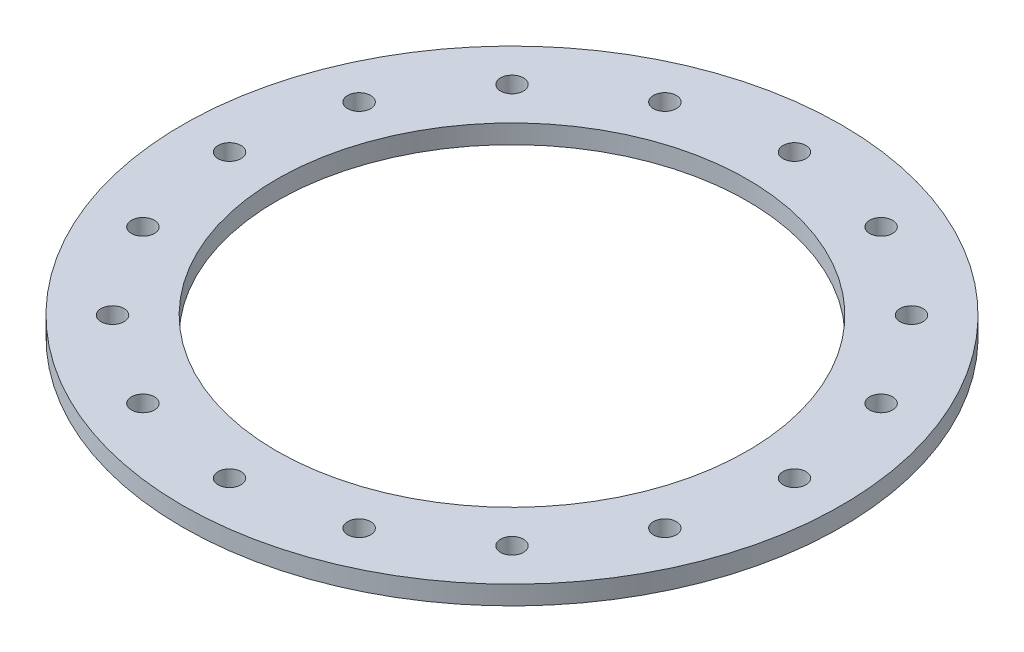
ISO-10303-21;
HEADER;
FILE_DESCRIPTION(('STEP AP214'),'2;1');
FILE_NAME('part.step','',(''),(''),'','','');
FILE_SCHEMA(('AUTOMOTIVE_DESIGN { 1 0 10303 214 1 1 1 1 }'));
ENDSEC;
DATA;
#1=APPLICATION_CONTEXT('core data for automotive mechanical design processes');
#2=APPLICATION_PROTOCOL_DEFINITION('international standard','automotive_design',2000,#1);
#3=PRODUCT_CONTEXT('',#1,'mechanical');
#4=PRODUCT('Part','Part','',(#3));
#5=PRODUCT_RELATED_PRODUCT_CATEGORY('part','',(#4));
#6=PRODUCT_DEFINITION_FORMATION('','',#4);
#7=PRODUCT_DEFINITION_CONTEXT('part definition',#1,'design');
#8=PRODUCT_DEFINITION('design','',#6,#7);
#9=PRODUCT_DEFINITION_SHAPE('','',#8);
#10=(LENGTH_UNIT() NAMED_UNIT(*) SI_UNIT(.MILLI.,.METRE.));
#11=(NAMED_UNIT(*) PLANE_ANGLE_UNIT() SI_UNIT($,.RADIAN.));
#12=(NAMED_UNIT(*) SI_UNIT($,.STERADIAN.) SOLID_ANGLE_UNIT());
#13=UNCERTAINTY_MEASURE_WITH_UNIT(LENGTH_MEASURE(1.E-05),#10,'distance_accuracy_value','');
#14=(GEOMETRIC_REPRESENTATION_CONTEXT(3) GLOBAL_UNCERTAINTY_ASSIGNED_CONTEXT((#13)) GLOBAL_UNIT_ASSIGNED_CONTEXT((#10,
#11,#12)) REPRESENTATION_CONTEXT('',''));
#15=CARTESIAN_POINT('',(0.,0.,0.));
#16=DIRECTION('',(0.,0.,1.));
#17=DIRECTION('',(1.,0.,0.));
#18=AXIS2_PLACEMENT_3D('',#15,#16,#17);
#19=CARTESIAN_POINT('',(0.,5.,0.));
#20=DIRECTION('',(0.,1.,0.));
#21=DIRECTION('',(0.,0.,1.));
#22=AXIS2_PLACEMENT_3D('',#19,#20,#21);
#23=PLANE('',#22);
#24=CARTESIAN_POINT('',(-106.066017177972,5.,-106.066017177958));
#25=DIRECTION('',(0.,1.,0.));
#26=DIRECTION('',(0.,0.,1.));
#27=AXIS2_PLACEMENT_3D('',#24,#25,#26);
#28=CIRCLE('',#27,6.09999999999999);
#29=CARTESIAN_POINT('',(-106.066017177972,5.,-99.9660171779577));
#30=VERTEX_POINT('',#29);
#31=EDGE_CURVE('E131',#30,#30,#28,.T.);
#32=ORIENTED_EDGE('',*,*,#31,.F.);
#33=EDGE_LOOP('',(#32));
#34=FACE_BOUND('',#33,.T.);
#35=CARTESIAN_POINT('',(-149.999999999965,5.,3.45529021714393E-11));
#36=DIRECTION('',(0.,1.,0.));
#37=DIRECTION('',(0.,0.,1.));
#38=AXIS2_PLACEMENT_3D('',#35,#36,#37);
#39=CIRCLE('',#38,6.09999999999998);
#40=CARTESIAN_POINT('',(-149.999999999965,5.,6.10000000003454));
#41=VERTEX_POINT('',#40);
#42=EDGE_CURVE('E119',#41,#41,#39,.T.);
#43=ORIENTED_EDGE('',*,*,#42,.F.);
#44=EDGE_LOOP('',(#43));
#45=FACE_BOUND('',#44,.T.);
#46=CARTESIAN_POINT('',(-106.066017177923,5.,106.066017178007));
#47=DIRECTION('',(0.,1.,0.));
#48=DIRECTION('',(0.,0.,1.));
#49=AXIS2_PLACEMENT_3D('',#46,#47,#48);
#50=CIRCLE('',#49,6.09999999999999);
#51=CARTESIAN_POINT('',(-106.066017177923,5.,112.166017178007));
#52=VERTEX_POINT('',#51);
#53=EDGE_CURVE('E107',#52,#52,#50,.T.);
#54=ORIENTED_EDGE('',*,*,#53,.F.);
#55=EDGE_LOOP('',(#54));
#56=FACE_BOUND('',#55,.T.);
#57=CARTESIAN_POINT('',(6.90690649389042E-11,5.,150.));
#58=DIRECTION('',(0.,1.,0.));
#59=DIRECTION('',(0.,0.,1.));
#60=AXIS2_PLACEMENT_3D('',#57,#58,#59);
#61=CIRCLE('',#60,6.1);
#62=CARTESIAN_POINT('',(6.90690649389042E-11,5.,156.1));
#63=VERTEX_POINT('',#62);
#64=EDGE_CURVE('E95',#63,#63,#61,.T.);
#65=ORIENTED_EDGE('',*,*,#64,.F.);
#66=EDGE_LOOP('',(#65));
#67=FACE_BOUND('',#66,.T.);
#68=CARTESIAN_POINT('',(106.066017178041,5.,106.066017177958));
#69=DIRECTION('',(0.,1.,0.));
#70=DIRECTION('',(0.,0.,1.));
#71=AXIS2_PLACEMENT_3D('',#68,#69,#70);
#72=CIRCLE('',#71,6.09999999999999);
#73=CARTESIAN_POINT('',(106.066017178041,5.,112.166017177958));
#74=VERTEX_POINT('',#73);
#75=EDGE_CURVE('E83',#74,#74,#72,.T.);
#76=ORIENTED_EDGE('',*,*,#75,.F.);
#77=EDGE_LOOP('',(#76));
#78=FACE_BOUND('',#77,.T.);
#79=CARTESIAN_POINT('',(150.000000000035,5.,-3.45345324694521E-11));
#80=DIRECTION('',(0.,1.,0.));
#81=DIRECTION('',(0.,0.,1.));
#82=AXIS2_PLACEMENT_3D('',#79,#80,#81);
#83=CIRCLE('',#82,6.09999999999998);
#84=CARTESIAN_POINT('',(150.000000000035,5.,6.09999999996545));
#85=VERTEX_POINT('',#84);
#86=EDGE_CURVE('E71',#85,#85,#83,.T.);
#87=ORIENTED_EDGE('',*,*,#86,.F.);
#88=EDGE_LOOP('',(#87));
#89=FACE_BOUND('',#88,.T.);
#90=CARTESIAN_POINT('',(106.066017177992,5.,-106.066017178007));
#91=DIRECTION('',(0.,1.,0.));
#92=DIRECTION('',(0.,0.,1.));
#93=AXIS2_PLACEMENT_3D('',#90,#91,#92);
#94=CIRCLE('',#93,6.09999999999999);
#95=CARTESIAN_POINT('',(106.066017177992,5.,-99.9660171780066));
#96=VERTEX_POINT('',#95);
#97=EDGE_CURVE('E59',#96,#96,#94,.T.);
#98=ORIENTED_EDGE('',*,*,#97,.F.);
#99=EDGE_LOOP('',(#98));
#100=FACE_BOUND('',#99,.T.);
#101=CARTESIAN_POINT('',(0.,5.,-150.));
#102=DIRECTION('',(0.,1.,0.));
#103=DIRECTION('',(0.,0.,1.));
#104=AXIS2_PLACEMENT_3D('',#101,#102,#103);
#105=CIRCLE('',#104,6.1);
#106=CARTESIAN_POINT('',(0.,5.,-143.9));
#107=VERTEX_POINT('',#106);
#108=EDGE_CURVE('E47',#107,#107,#105,.T.);
#109=ORIENTED_EDGE('',*,*,#108,.F.);
#110=EDGE_LOOP('',(#109));
#111=FACE_BOUND('',#110,.T.);
#112=CARTESIAN_POINT('',(0.,5.,0.));
#113=DIRECTION('',(0.,1.,0.));
#114=DIRECTION('',(0.,0.,1.));
#115=AXIS2_PLACEMENT_3D('',#112,#113,#114);
#116=CIRCLE('',#115,175.);
#117=CARTESIAN_POINT('',(0.,5.,175.));
#118=VERTEX_POINT('',#117);
#119=EDGE_CURVE('E10',#118,#118,#116,.T.);
#120=ORIENTED_EDGE('',*,*,#119,.T.);
#121=EDGE_LOOP('',(#120));
#122=FACE_BOUND('',#121,.T.);
#123=CARTESIAN_POINT('',(0.,5.,0.));
#124=DIRECTION('',(0.,1.,0.));
#125=DIRECTION('',(0.,0.,1.));
#126=AXIS2_PLACEMENT_3D('',#123,#124,#125);
#127=CIRCLE('',#126,125.);
#128=CARTESIAN_POINT('',(0.,5.,125.));
#129=VERTEX_POINT('',#128);
#130=EDGE_CURVE('E42',#129,#129,#127,.T.);
#131=ORIENTED_EDGE('',*,*,#130,.F.);
#132=EDGE_LOOP('',(#131));
#133=FACE_BOUND('',#132,.T.);
#134=CARTESIAN_POINT('',(57.402514854766,5.,-138.581929876706));
#135=DIRECTION('',(0.,1.,0.));
#136=DIRECTION('',(0.,0.,1.));
#137=AXIS2_PLACEMENT_3D('',#134,#135,#136);
#138=CIRCLE('',#137,6.09999999999999);
#139=CARTESIAN_POINT('',(57.402514854766,5.,-132.481929876706));
#140=VERTEX_POINT('',#139);
#141=EDGE_CURVE('E53',#140,#140,#138,.T.);
#142=ORIENTED_EDGE('',*,*,#141,.F.);
#143=EDGE_LOOP('',(#142));
#144=FACE_BOUND('',#143,.T.);
#145=CARTESIAN_POINT('',(138.581929876714,5.,-57.4025148547954));
#146=DIRECTION('',(0.,1.,0.));
#147=DIRECTION('',(0.,0.,1.));
#148=AXIS2_PLACEMENT_3D('',#145,#146,#147);
#149=CIRCLE('',#148,6.09999999999998);
#150=CARTESIAN_POINT('',(138.581929876714,5.,-51.3025148547954));
#151=VERTEX_POINT('',#150);
#152=EDGE_CURVE('E65',#151,#151,#149,.T.);
#153=ORIENTED_EDGE('',*,*,#152,.F.);
#154=EDGE_LOOP('',(#153));
#155=FACE_BOUND('',#154,.T.);
#156=CARTESIAN_POINT('',(138.581929876741,5.,57.4025148547315));
#157=DIRECTION('',(0.,1.,0.));
#158=DIRECTION('',(0.,0.,1.));
#159=AXIS2_PLACEMENT_3D('',#156,#157,#158);
#160=CIRCLE('',#159,6.09999999999998);
#161=CARTESIAN_POINT('',(138.581929876741,5.,63.5025148547315));
#162=VERTEX_POINT('',#161);
#163=EDGE_CURVE('E77',#162,#162,#160,.T.);
#164=ORIENTED_EDGE('',*,*,#163,.F.);
#165=EDGE_LOOP('',(#164));
#166=FACE_BOUND('',#165,.T.);
#167=CARTESIAN_POINT('',(57.4025148548299,5.,138.58192987668));
#168=DIRECTION('',(0.,1.,0.));
#169=DIRECTION('',(0.,0.,1.));
#170=AXIS2_PLACEMENT_3D('',#167,#168,#169);
#171=CIRCLE('',#170,6.1);
#172=CARTESIAN_POINT('',(57.4025148548299,5.,144.68192987668));
#173=VERTEX_POINT('',#172);
#174=EDGE_CURVE('E89',#173,#173,#171,.T.);
#175=ORIENTED_EDGE('',*,*,#174,.F.);
#176=EDGE_LOOP('',(#175));
#177=FACE_BOUND('',#176,.T.);
#178=CARTESIAN_POINT('',(-57.402514854697,5.,138.581929876706));
#179=DIRECTION('',(0.,1.,0.));
#180=DIRECTION('',(0.,0.,1.));
#181=AXIS2_PLACEMENT_3D('',#178,#179,#180);
#182=CIRCLE('',#181,6.1);
#183=CARTESIAN_POINT('',(-57.402514854697,5.,144.681929876706));
#184=VERTEX_POINT('',#183);
#185=EDGE_CURVE('E101',#184,#184,#182,.T.);
#186=ORIENTED_EDGE('',*,*,#185,.F.);
#187=EDGE_LOOP('',(#186));
#188=FACE_BOUND('',#187,.T.);
#189=CARTESIAN_POINT('',(-138.581929876645,5.,57.4025148547954));
#190=DIRECTION('',(0.,1.,0.));
#191=DIRECTION('',(0.,0.,1.));
#192=AXIS2_PLACEMENT_3D('',#189,#190,#191);
#193=CIRCLE('',#192,6.09999999999998);
#194=CARTESIAN_POINT('',(-138.581929876645,5.,63.5025148547954));
#195=VERTEX_POINT('',#194);
#196=EDGE_CURVE('E113',#195,#195,#193,.T.);
#197=ORIENTED_EDGE('',*,*,#196,.F.);
#198=EDGE_LOOP('',(#197));
#199=FACE_BOUND('',#198,.T.);
#200=CARTESIAN_POINT('',(-138.581929876672,5.,-57.4025148547316));
#201=DIRECTION('',(0.,1.,0.));
#202=DIRECTION('',(0.,0.,1.));
#203=AXIS2_PLACEMENT_3D('',#200,#201,#202);
#204=CIRCLE('',#203,6.09999999999998);
#205=CARTESIAN_POINT('',(-138.581929876672,5.,-51.3025148547316));
#206=VERTEX_POINT('',#205);
#207=EDGE_CURVE('E125',#206,#206,#204,.T.);
#208=ORIENTED_EDGE('',*,*,#207,.F.);
#209=EDGE_LOOP('',(#208));
#210=FACE_BOUND('',#209,.T.);
#211=CARTESIAN_POINT('',(-57.4025148547609,5.,-138.58192987668));
#212=DIRECTION('',(0.,1.,0.));
#213=DIRECTION('',(0.,0.,1.));
#214=AXIS2_PLACEMENT_3D('',#211,#212,#213);
#215=CIRCLE('',#214,6.1);
#216=CARTESIAN_POINT('',(-57.4025148547609,5.,-132.48192987668));
#217=VERTEX_POINT('',#216);
#218=EDGE_CURVE('E137',#217,#217,#215,.T.);
#219=ORIENTED_EDGE('',*,*,#218,.F.);
#220=EDGE_LOOP('',(#219));
#221=FACE_BOUND('',#220,.T.);
#222=ADVANCED_FACE('F31',(#34,#45,#56,#67,#78,#89,#100,#111,#122,#133,#144,#155,#166,#177,#188,
#199,#210,#221),#23,.T.);
#223=CARTESIAN_POINT('',(0.,-5.,0.));
#224=DIRECTION('',(0.,1.,0.));
#225=DIRECTION('',(0.,0.,1.));
#226=AXIS2_PLACEMENT_3D('',#223,#224,#225);
#227=PLANE('',#226);
#228=CARTESIAN_POINT('',(0.,-5.,0.));
#229=DIRECTION('',(0.,1.,0.));
#230=DIRECTION('',(0.,0.,1.));
#231=AXIS2_PLACEMENT_3D('',#228,#229,#230);
#232=CIRCLE('',#231,175.);
#233=CARTESIAN_POINT('',(0.,-5.,175.));
#234=VERTEX_POINT('',#233);
#235=EDGE_CURVE('E35',#234,#234,#232,.T.);
#236=ORIENTED_EDGE('',*,*,#235,.F.);
#237=EDGE_LOOP('',(#236));
#238=FACE_BOUND('',#237,.T.);
#239=CARTESIAN_POINT('',(0.,-5.,0.));
#240=DIRECTION('',(0.,1.,0.));
#241=DIRECTION('',(0.,0.,1.));
#242=AXIS2_PLACEMENT_3D('',#239,#240,#241);
#243=CIRCLE('',#242,125.);
#244=CARTESIAN_POINT('',(0.,-5.,125.));
#245=VERTEX_POINT('',#244);
#246=EDGE_CURVE('E44',#245,#245,#243,.T.);
#247=ORIENTED_EDGE('',*,*,#246,.T.);
#248=EDGE_LOOP('',(#247));
#249=FACE_BOUND('',#248,.T.);
#250=CARTESIAN_POINT('',(0.,-5.,-150.));
#251=DIRECTION('',(0.,1.,0.));
#252=DIRECTION('',(0.,0.,1.));
#253=AXIS2_PLACEMENT_3D('',#250,#251,#252);
#254=CIRCLE('',#253,6.1);
#255=CARTESIAN_POINT('',(0.,-5.,-143.9));
#256=VERTEX_POINT('',#255);
#257=EDGE_CURVE('E50',#256,#256,#254,.T.);
#258=ORIENTED_EDGE('',*,*,#257,.T.);
#259=EDGE_LOOP('',(#258));
#260=FACE_BOUND('',#259,.T.);
#261=CARTESIAN_POINT('',(57.402514854766,-5.,-138.581929876706));
#262=DIRECTION('',(0.,1.,0.));
#263=DIRECTION('',(0.,0.,1.));
#264=AXIS2_PLACEMENT_3D('',#261,#262,#263);
#265=CIRCLE('',#264,6.09999999999999);
#266=CARTESIAN_POINT('',(57.402514854766,-5.,-132.481929876706));
#267=VERTEX_POINT('',#266);
#268=EDGE_CURVE('E56',#267,#267,#265,.T.);
#269=ORIENTED_EDGE('',*,*,#268,.T.);
#270=EDGE_LOOP('',(#269));
#271=FACE_BOUND('',#270,.T.);
#272=CARTESIAN_POINT('',(106.066017177992,-5.,-106.066017178007));
#273=DIRECTION('',(0.,1.,0.));
#274=DIRECTION('',(0.,0.,1.));
#275=AXIS2_PLACEMENT_3D('',#272,#273,#274);
#276=CIRCLE('',#275,6.09999999999999);
#277=CARTESIAN_POINT('',(106.066017177992,-5.,-99.9660171780066));
#278=VERTEX_POINT('',#277);
#279=EDGE_CURVE('E62',#278,#278,#276,.T.);
#280=ORIENTED_EDGE('',*,*,#279,.T.);
#281=EDGE_LOOP('',(#280));
#282=FACE_BOUND('',#281,.T.);
#283=CARTESIAN_POINT('',(138.581929876714,-5.,-57.4025148547954));
#284=DIRECTION('',(0.,1.,0.));
#285=DIRECTION('',(0.,0.,1.));
#286=AXIS2_PLACEMENT_3D('',#283,#284,#285);
#287=CIRCLE('',#286,6.09999999999998);
#288=CARTESIAN_POINT('',(138.581929876714,-5.,-51.3025148547954));
#289=VERTEX_POINT('',#288);
#290=EDGE_CURVE('E68',#289,#289,#287,.T.);
#291=ORIENTED_EDGE('',*,*,#290,.T.);
#292=EDGE_LOOP('',(#291));
#293=FACE_BOUND('',#292,.T.);
#294=CARTESIAN_POINT('',(150.000000000035,-5.,-3.45345324694521E-11));
#295=DIRECTION('',(0.,1.,0.));
#296=DIRECTION('',(0.,0.,1.));
#297=AXIS2_PLACEMENT_3D('',#294,#295,#296);
#298=CIRCLE('',#297,6.09999999999998);
#299=CARTESIAN_POINT('',(150.000000000035,-5.,6.09999999996545));
#300=VERTEX_POINT('',#299);
#301=EDGE_CURVE('E74',#300,#300,#298,.T.);
#302=ORIENTED_EDGE('',*,*,#301,.T.);
#303=EDGE_LOOP('',(#302));
#304=FACE_BOUND('',#303,.T.);
#305=CARTESIAN_POINT('',(138.581929876741,-5.,57.4025148547315));
#306=DIRECTION('',(0.,1.,0.));
#307=DIRECTION('',(0.,0.,1.));
#308=AXIS2_PLACEMENT_3D('',#305,#306,#307);
#309=CIRCLE('',#308,6.09999999999998);
#310=CARTESIAN_POINT('',(138.581929876741,-5.,63.5025148547315));
#311=VERTEX_POINT('',#310);
#312=EDGE_CURVE('E80',#311,#311,#309,.T.);
#313=ORIENTED_EDGE('',*,*,#312,.T.);
#314=EDGE_LOOP('',(#313));
#315=FACE_BOUND('',#314,.T.);
#316=CARTESIAN_POINT('',(106.066017178041,-5.,106.066017177958));
#317=DIRECTION('',(0.,1.,0.));
#318=DIRECTION('',(0.,0.,1.));
#319=AXIS2_PLACEMENT_3D('',#316,#317,#318);
#320=CIRCLE('',#319,6.09999999999999);
#321=CARTESIAN_POINT('',(106.066017178041,-5.,112.166017177958));
#322=VERTEX_POINT('',#321);
#323=EDGE_CURVE('E86',#322,#322,#320,.T.);
#324=ORIENTED_EDGE('',*,*,#323,.T.);
#325=EDGE_LOOP('',(#324));
#326=FACE_BOUND('',#325,.T.);
#327=CARTESIAN_POINT('',(57.4025148548299,-5.,138.58192987668));
#328=DIRECTION('',(0.,1.,0.));
#329=DIRECTION('',(0.,0.,1.));
#330=AXIS2_PLACEMENT_3D('',#327,#328,#329);
#331=CIRCLE('',#330,6.1);
#332=CARTESIAN_POINT('',(57.4025148548299,-5.,144.68192987668));
#333=VERTEX_POINT('',#332);
#334=EDGE_CURVE('E92',#333,#333,#331,.T.);
#335=ORIENTED_EDGE('',*,*,#334,.T.);
#336=EDGE_LOOP('',(#335));
#337=FACE_BOUND('',#336,.T.);
#338=CARTESIAN_POINT('',(6.90690649389042E-11,-5.,150.));
#339=DIRECTION('',(0.,1.,0.));
#340=DIRECTION('',(0.,0.,1.));
#341=AXIS2_PLACEMENT_3D('',#338,#339,#340);
#342=CIRCLE('',#341,6.1);
#343=CARTESIAN_POINT('',(6.90690649389042E-11,-5.,156.1));
#344=VERTEX_POINT('',#343);
#345=EDGE_CURVE('E98',#344,#344,#342,.T.);
#346=ORIENTED_EDGE('',*,*,#345,.T.);
#347=EDGE_LOOP('',(#346));
#348=FACE_BOUND('',#347,.T.);
#349=CARTESIAN_POINT('',(-57.402514854697,-5.,138.581929876706));
#350=DIRECTION('',(0.,1.,0.));
#351=DIRECTION('',(0.,0.,1.));
#352=AXIS2_PLACEMENT_3D('',#349,#350,#351);
#353=CIRCLE('',#352,6.1);
#354=CARTESIAN_POINT('',(-57.402514854697,-5.,144.681929876706));
#355=VERTEX_POINT('',#354);
#356=EDGE_CURVE('E104',#355,#355,#353,.T.);
#357=ORIENTED_EDGE('',*,*,#356,.T.);
#358=EDGE_LOOP('',(#357));
#359=FACE_BOUND('',#358,.T.);
#360=CARTESIAN_POINT('',(-106.066017177923,-5.,106.066017178007));
#361=DIRECTION('',(0.,1.,0.));
#362=DIRECTION('',(0.,0.,1.));
#363=AXIS2_PLACEMENT_3D('',#360,#361,#362);
#364=CIRCLE('',#363,6.09999999999999);
#365=CARTESIAN_POINT('',(-106.066017177923,-5.,112.166017178007));
#366=VERTEX_POINT('',#365);
#367=EDGE_CURVE('E110',#366,#366,#364,.T.);
#368=ORIENTED_EDGE('',*,*,#367,.T.);
#369=EDGE_LOOP('',(#368));
#370=FACE_BOUND('',#369,.T.);
#371=CARTESIAN_POINT('',(-138.581929876645,-5.,57.4025148547954));
#372=DIRECTION('',(0.,1.,0.));
#373=DIRECTION('',(0.,0.,1.));
#374=AXIS2_PLACEMENT_3D('',#371,#372,#373);
#375=CIRCLE('',#374,6.09999999999998);
#376=CARTESIAN_POINT('',(-138.581929876645,-5.,63.5025148547954));
#377=VERTEX_POINT('',#376);
#378=EDGE_CURVE('E116',#377,#377,#375,.T.);
#379=ORIENTED_EDGE('',*,*,#378,.T.);
#380=EDGE_LOOP('',(#379));
#381=FACE_BOUND('',#380,.T.);
#382=CARTESIAN_POINT('',(-149.999999999965,-5.,3.45529021714393E-11));
#383=DIRECTION('',(0.,1.,0.));
#384=DIRECTION('',(0.,0.,1.));
#385=AXIS2_PLACEMENT_3D('',#382,#383,#384);
#386=CIRCLE('',#385,6.09999999999998);
#387=CARTESIAN_POINT('',(-149.999999999965,-5.,6.10000000003454));
#388=VERTEX_POINT('',#387);
#389=EDGE_CURVE('E122',#388,#388,#386,.T.);
#390=ORIENTED_EDGE('',*,*,#389,.T.);
#391=EDGE_LOOP('',(#390));
#392=FACE_BOUND('',#391,.T.);
#393=CARTESIAN_POINT('',(-138.581929876672,-5.,-57.4025148547316));
#394=DIRECTION('',(0.,1.,0.));
#395=DIRECTION('',(0.,0.,1.));
#396=AXIS2_PLACEMENT_3D('',#393,#394,#395);
#397=CIRCLE('',#396,6.09999999999998);
#398=CARTESIAN_POINT('',(-138.581929876672,-5.,-51.3025148547316));
#399=VERTEX_POINT('',#398);
#400=EDGE_CURVE('E128',#399,#399,#397,.T.);
#401=ORIENTED_EDGE('',*,*,#400,.T.);
#402=EDGE_LOOP('',(#401));
#403=FACE_BOUND('',#402,.T.);
#404=CARTESIAN_POINT('',(-106.066017177972,-5.,-106.066017177958));
#405=DIRECTION('',(0.,1.,0.));
#406=DIRECTION('',(0.,0.,1.));
#407=AXIS2_PLACEMENT_3D('',#404,#405,#406);
#408=CIRCLE('',#407,6.09999999999999);
#409=CARTESIAN_POINT('',(-106.066017177972,-5.,-99.9660171779577));
#410=VERTEX_POINT('',#409);
#411=EDGE_CURVE('E134',#410,#410,#408,.T.);
#412=ORIENTED_EDGE('',*,*,#411,.T.);
#413=EDGE_LOOP('',(#412));
#414=FACE_BOUND('',#413,.T.);
#415=CARTESIAN_POINT('',(-57.4025148547609,-5.,-138.58192987668));
#416=DIRECTION('',(0.,1.,0.));
#417=DIRECTION('',(0.,0.,1.));
#418=AXIS2_PLACEMENT_3D('',#415,#416,#417);
#419=CIRCLE('',#418,6.1);
#420=CARTESIAN_POINT('',(-57.4025148547609,-5.,-132.48192987668));
#421=VERTEX_POINT('',#420);
#422=EDGE_CURVE('E140',#421,#421,#419,.T.);
#423=ORIENTED_EDGE('',*,*,#422,.T.);
#424=EDGE_LOOP('',(#423));
#425=FACE_BOUND('',#424,.T.);
#426=ADVANCED_FACE('F150',(#238,#249,#260,#271,#282,#293,#304,#315,#326,#337,#348,#359,#370,
#381,#392,#403,#414,#425),#227,.F.);
#427=CARTESIAN_POINT('',(0.,5.,0.));
#428=DIRECTION('',(0.,-1.,0.));
#429=DIRECTION('',(0.,0.,-1.));
#430=AXIS2_PLACEMENT_3D('',#427,#428,#429);
#431=CYLINDRICAL_SURFACE('',#430,175.);
#432=ORIENTED_EDGE('',*,*,#119,.F.);
#433=EDGE_LOOP('',(#432));
#434=FACE_BOUND('',#433,.T.);
#435=ORIENTED_EDGE('',*,*,#235,.T.);
#436=EDGE_LOOP('',(#435));
#437=FACE_BOUND('',#436,.T.);
#438=ADVANCED_FACE('F33',(#434,#437),#431,.T.);
#439=CARTESIAN_POINT('',(0.,5.,0.));
#440=DIRECTION('',(0.,-1.,0.));
#441=DIRECTION('',(0.,0.,-1.));
#442=AXIS2_PLACEMENT_3D('',#439,#440,#441);
#443=CYLINDRICAL_SURFACE('',#442,125.);
#444=ORIENTED_EDGE('',*,*,#130,.T.);
#445=EDGE_LOOP('',(#444));
#446=FACE_BOUND('',#445,.T.);
#447=ORIENTED_EDGE('',*,*,#246,.F.);
#448=EDGE_LOOP('',(#447));
#449=FACE_BOUND('',#448,.T.);
#450=ADVANCED_FACE('F160',(#446,#449),#443,.F.);
#451=CARTESIAN_POINT('',(0.,5.,-150.));
#452=DIRECTION('',(0.,-1.,0.));
#453=DIRECTION('',(0.,0.,-1.));
#454=AXIS2_PLACEMENT_3D('',#451,#452,#453);
#455=CYLINDRICAL_SURFACE('',#454,6.1);
#456=ORIENTED_EDGE('',*,*,#108,.T.);
#457=EDGE_LOOP('',(#456));
#458=FACE_BOUND('',#457,.T.);
#459=ORIENTED_EDGE('',*,*,#257,.F.);
#460=EDGE_LOOP('',(#459));
#461=FACE_BOUND('',#460,.T.);
#462=ADVANCED_FACE('F163',(#458,#461),#455,.F.);
#463=CARTESIAN_POINT('',(57.402514854766,5.,-138.581929876706));
#464=DIRECTION('',(0.,-1.,0.));
#465=DIRECTION('',(0.,0.,-1.));
#466=AXIS2_PLACEMENT_3D('',#463,#464,#465);
#467=CYLINDRICAL_SURFACE('',#466,6.09999999999999);
#468=ORIENTED_EDGE('',*,*,#141,.T.);
#469=EDGE_LOOP('',(#468));
#470=FACE_BOUND('',#469,.T.);
#471=ORIENTED_EDGE('',*,*,#268,.F.);
#472=EDGE_LOOP('',(#471));
#473=FACE_BOUND('',#472,.T.);
#474=ADVANCED_FACE('F167',(#470,#473),#467,.F.);
#475=CARTESIAN_POINT('',(106.066017177992,5.,-106.066017178007));
#476=DIRECTION('',(0.,-1.,0.));
#477=DIRECTION('',(0.,0.,-1.));
#478=AXIS2_PLACEMENT_3D('',#475,#476,#477);
#479=CYLINDRICAL_SURFACE('',#478,6.09999999999999);
#480=ORIENTED_EDGE('',*,*,#97,.T.);
#481=EDGE_LOOP('',(#480));
#482=FACE_BOUND('',#481,.T.);
#483=ORIENTED_EDGE('',*,*,#279,.F.);
#484=EDGE_LOOP('',(#483));
#485=FACE_BOUND('',#484,.T.);
#486=ADVANCED_FACE('F171',(#482,#485),#479,.F.);
#487=CARTESIAN_POINT('',(138.581929876714,5.,-57.4025148547954));
#488=DIRECTION('',(0.,-1.,0.));
#489=DIRECTION('',(0.,0.,-1.));
#490=AXIS2_PLACEMENT_3D('',#487,#488,#489);
#491=CYLINDRICAL_SURFACE('',#490,6.09999999999998);
#492=ORIENTED_EDGE('',*,*,#152,.T.);
#493=EDGE_LOOP('',(#492));
#494=FACE_BOUND('',#493,.T.);
#495=ORIENTED_EDGE('',*,*,#290,.F.);
#496=EDGE_LOOP('',(#495));
#497=FACE_BOUND('',#496,.T.);
#498=ADVANCED_FACE('F175',(#494,#497),#491,.F.);
#499=CARTESIAN_POINT('',(150.000000000035,5.,-3.45345324694521E-11));
#500=DIRECTION('',(0.,-1.,0.));
#501=DIRECTION('',(0.,0.,-1.));
#502=AXIS2_PLACEMENT_3D('',#499,#500,#501);
#503=CYLINDRICAL_SURFACE('',#502,6.09999999999998);
#504=ORIENTED_EDGE('',*,*,#86,.T.);
#505=EDGE_LOOP('',(#504));
#506=FACE_BOUND('',#505,.T.);
#507=ORIENTED_EDGE('',*,*,#301,.F.);
#508=EDGE_LOOP('',(#507));
#509=FACE_BOUND('',#508,.T.);
#510=ADVANCED_FACE('F179',(#506,#509),#503,.F.);
#511=CARTESIAN_POINT('',(138.581929876741,5.,57.4025148547315));
#512=DIRECTION('',(0.,-1.,0.));
#513=DIRECTION('',(0.,0.,-1.));
#514=AXIS2_PLACEMENT_3D('',#511,#512,#513);
#515=CYLINDRICAL_SURFACE('',#514,6.09999999999998);
#516=ORIENTED_EDGE('',*,*,#163,.T.);
#517=EDGE_LOOP('',(#516));
#518=FACE_BOUND('',#517,.T.);
#519=ORIENTED_EDGE('',*,*,#312,.F.);
#520=EDGE_LOOP('',(#519));
#521=FACE_BOUND('',#520,.T.);
#522=ADVANCED_FACE('F183',(#518,#521),#515,.F.);
#523=CARTESIAN_POINT('',(106.066017178041,5.,106.066017177958));
#524=DIRECTION('',(0.,-1.,0.));
#525=DIRECTION('',(0.,0.,-1.));
#526=AXIS2_PLACEMENT_3D('',#523,#524,#525);
#527=CYLINDRICAL_SURFACE('',#526,6.09999999999999);
#528=ORIENTED_EDGE('',*,*,#75,.T.);
#529=EDGE_LOOP('',(#528));
#530=FACE_BOUND('',#529,.T.);
#531=ORIENTED_EDGE('',*,*,#323,.F.);
#532=EDGE_LOOP('',(#531));
#533=FACE_BOUND('',#532,.T.);
#534=ADVANCED_FACE('F187',(#530,#533),#527,.F.);
#535=CARTESIAN_POINT('',(57.4025148548299,5.,138.58192987668));
#536=DIRECTION('',(0.,-1.,0.));
#537=DIRECTION('',(0.,0.,-1.));
#538=AXIS2_PLACEMENT_3D('',#535,#536,#537);
#539=CYLINDRICAL_SURFACE('',#538,6.1);
#540=ORIENTED_EDGE('',*,*,#174,.T.);
#541=EDGE_LOOP('',(#540));
#542=FACE_BOUND('',#541,.T.);
#543=ORIENTED_EDGE('',*,*,#334,.F.);
#544=EDGE_LOOP('',(#543));
#545=FACE_BOUND('',#544,.T.);
#546=ADVANCED_FACE('F191',(#542,#545),#539,.F.);
#547=CARTESIAN_POINT('',(6.90690649389042E-11,5.,150.));
#548=DIRECTION('',(0.,-1.,0.));
#549=DIRECTION('',(0.,0.,-1.));
#550=AXIS2_PLACEMENT_3D('',#547,#548,#549);
#551=CYLINDRICAL_SURFACE('',#550,6.1);
#552=ORIENTED_EDGE('',*,*,#64,.T.);
#553=EDGE_LOOP('',(#552));
#554=FACE_BOUND('',#553,.T.);
#555=ORIENTED_EDGE('',*,*,#345,.F.);
#556=EDGE_LOOP('',(#555));
#557=FACE_BOUND('',#556,.T.);
#558=ADVANCED_FACE('F195',(#554,#557),#551,.F.);
#559=CARTESIAN_POINT('',(-57.402514854697,5.,138.581929876706));
#560=DIRECTION('',(0.,-1.,0.));
#561=DIRECTION('',(0.,0.,-1.));
#562=AXIS2_PLACEMENT_3D('',#559,#560,#561);
#563=CYLINDRICAL_SURFACE('',#562,6.1);
#564=ORIENTED_EDGE('',*,*,#185,.T.);
#565=EDGE_LOOP('',(#564));
#566=FACE_BOUND('',#565,.T.);
#567=ORIENTED_EDGE('',*,*,#356,.F.);
#568=EDGE_LOOP('',(#567));
#569=FACE_BOUND('',#568,.T.);
#570=ADVANCED_FACE('F199',(#566,#569),#563,.F.);
#571=CARTESIAN_POINT('',(-106.066017177923,5.,106.066017178007));
#572=DIRECTION('',(0.,-1.,0.));
#573=DIRECTION('',(0.,0.,-1.));
#574=AXIS2_PLACEMENT_3D('',#571,#572,#573);
#575=CYLINDRICAL_SURFACE('',#574,6.09999999999999);
#576=ORIENTED_EDGE('',*,*,#53,.T.);
#577=EDGE_LOOP('',(#576));
#578=FACE_BOUND('',#577,.T.);
#579=ORIENTED_EDGE('',*,*,#367,.F.);
#580=EDGE_LOOP('',(#579));
#581=FACE_BOUND('',#580,.T.);
#582=ADVANCED_FACE('F203',(#578,#581),#575,.F.);
#583=CARTESIAN_POINT('',(-138.581929876645,5.,57.4025148547954));
#584=DIRECTION('',(0.,-1.,0.));
#585=DIRECTION('',(0.,0.,-1.));
#586=AXIS2_PLACEMENT_3D('',#583,#584,#585);
#587=CYLINDRICAL_SURFACE('',#586,6.09999999999998);
#588=ORIENTED_EDGE('',*,*,#196,.T.);
#589=EDGE_LOOP('',(#588));
#590=FACE_BOUND('',#589,.T.);
#591=ORIENTED_EDGE('',*,*,#378,.F.);
#592=EDGE_LOOP('',(#591));
#593=FACE_BOUND('',#592,.T.);
#594=ADVANCED_FACE('F207',(#590,#593),#587,.F.);
#595=CARTESIAN_POINT('',(-149.999999999965,5.,3.45529021714393E-11));
#596=DIRECTION('',(0.,-1.,0.));
#597=DIRECTION('',(0.,0.,-1.));
#598=AXIS2_PLACEMENT_3D('',#595,#596,#597);
#599=CYLINDRICAL_SURFACE('',#598,6.09999999999998);
#600=ORIENTED_EDGE('',*,*,#42,.T.);
#601=EDGE_LOOP('',(#600));
#602=FACE_BOUND('',#601,.T.);
#603=ORIENTED_EDGE('',*,*,#389,.F.);
#604=EDGE_LOOP('',(#603));
#605=FACE_BOUND('',#604,.T.);
#606=ADVANCED_FACE('F211',(#602,#605),#599,.F.);
#607=CARTESIAN_POINT('',(-138.581929876672,5.,-57.4025148547316));
#608=DIRECTION('',(0.,-1.,0.));
#609=DIRECTION('',(0.,0.,-1.));
#610=AXIS2_PLACEMENT_3D('',#607,#608,#609);
#611=CYLINDRICAL_SURFACE('',#610,6.09999999999998);
#612=ORIENTED_EDGE('',*,*,#207,.T.);
#613=EDGE_LOOP('',(#612));
#614=FACE_BOUND('',#613,.T.);
#615=ORIENTED_EDGE('',*,*,#400,.F.);
#616=EDGE_LOOP('',(#615));
#617=FACE_BOUND('',#616,.T.);
#618=ADVANCED_FACE('F215',(#614,#617),#611,.F.);
#619=CARTESIAN_POINT('',(-106.066017177972,5.,-106.066017177958));
#620=DIRECTION('',(0.,-1.,0.));
#621=DIRECTION('',(0.,0.,-1.));
#622=AXIS2_PLACEMENT_3D('',#619,#620,#621);
#623=CYLINDRICAL_SURFACE('',#622,6.09999999999999);
#624=ORIENTED_EDGE('',*,*,#31,.T.);
#625=EDGE_LOOP('',(#624));
#626=FACE_BOUND('',#625,.T.);
#627=ORIENTED_EDGE('',*,*,#411,.F.);
#628=EDGE_LOOP('',(#627));
#629=FACE_BOUND('',#628,.T.);
#630=ADVANCED_FACE('F219',(#626,#629),#623,.F.);
#631=CARTESIAN_POINT('',(-57.4025148547609,5.,-138.58192987668));
#632=DIRECTION('',(0.,-1.,0.));
#633=DIRECTION('',(0.,0.,-1.));
#634=AXIS2_PLACEMENT_3D('',#631,#632,#633);
#635=CYLINDRICAL_SURFACE('',#634,6.1);
#636=ORIENTED_EDGE('',*,*,#218,.T.);
#637=EDGE_LOOP('',(#636));
#638=FACE_BOUND('',#637,.T.);
#639=ORIENTED_EDGE('',*,*,#422,.F.);
#640=EDGE_LOOP('',(#639));
#641=FACE_BOUND('',#640,.T.);
#642=ADVANCED_FACE('F146',(#638,#641),#635,.F.);
#643=CLOSED_SHELL('',(#222,#426,#438,#450,#462,#474,#486,#498,#510,#522,#534,#546,#558,#570,
#582,#594,#606,#618,#630,#642));
#644=MANIFOLD_SOLID_BREP('B2',#643);
#645=ADVANCED_BREP_SHAPE_REPRESENTATION('',(#18,#644),#14);
#646=SHAPE_DEFINITION_REPRESENTATION(#9,#645);
ENDSEC;
END-ISO-10303-21;
